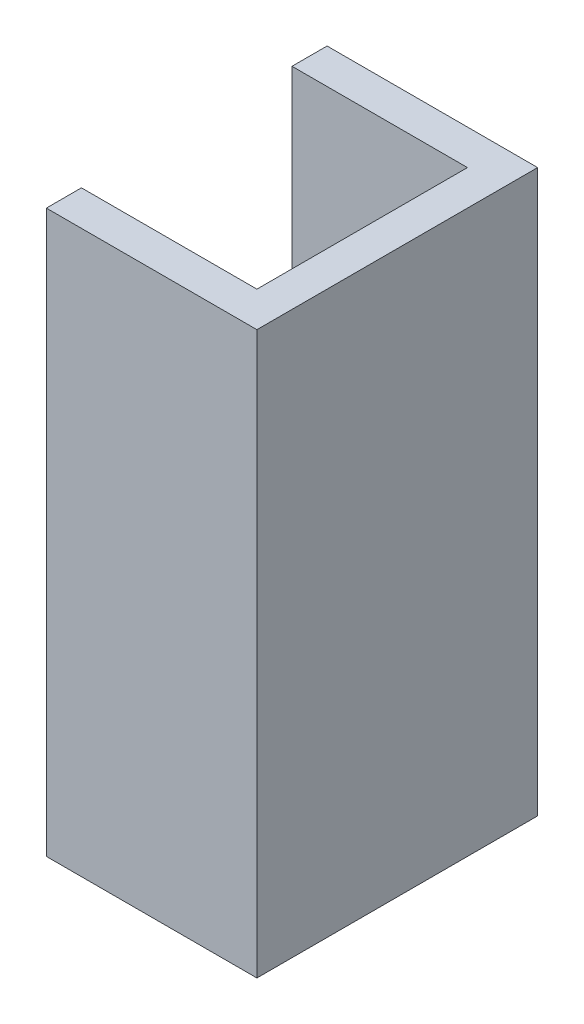
ISO-10303-21;
HEADER;
FILE_DESCRIPTION(('STEP AP214'),'2;1');
FILE_NAME('part.step','',(''),(''),'','','');
FILE_SCHEMA(('AUTOMOTIVE_DESIGN { 1 0 10303 214 1 1 1 1 }'));
ENDSEC;
DATA;
#1=APPLICATION_CONTEXT('core data for automotive mechanical design processes');
#2=APPLICATION_PROTOCOL_DEFINITION('international standard','automotive_design',2000,#1);
#3=PRODUCT_CONTEXT('',#1,'mechanical');
#4=PRODUCT('Part','Part','',(#3));
#5=PRODUCT_RELATED_PRODUCT_CATEGORY('part','',(#4));
#6=PRODUCT_DEFINITION_FORMATION('','',#4);
#7=PRODUCT_DEFINITION_CONTEXT('part definition',#1,'design');
#8=PRODUCT_DEFINITION('design','',#6,#7);
#9=PRODUCT_DEFINITION_SHAPE('','',#8);
#10=(LENGTH_UNIT() NAMED_UNIT(*) SI_UNIT(.MILLI.,.METRE.));
#11=(NAMED_UNIT(*) PLANE_ANGLE_UNIT() SI_UNIT($,.RADIAN.));
#12=(NAMED_UNIT(*) SI_UNIT($,.STERADIAN.) SOLID_ANGLE_UNIT());
#13=UNCERTAINTY_MEASURE_WITH_UNIT(LENGTH_MEASURE(1.E-05),#10,'distance_accuracy_value','');
#14=(GEOMETRIC_REPRESENTATION_CONTEXT(3) GLOBAL_UNCERTAINTY_ASSIGNED_CONTEXT((#13)) GLOBAL_UNIT_ASSIGNED_CONTEXT((#10,
#11,#12)) REPRESENTATION_CONTEXT('',''));
#15=CARTESIAN_POINT('',(0.,0.,0.));
#16=DIRECTION('',(0.,0.,1.));
#17=DIRECTION('',(1.,0.,0.));
#18=AXIS2_PLACEMENT_3D('',#15,#16,#17);
#19=CARTESIAN_POINT('',(-2.,9.7,0.42));
#20=DIRECTION('',(0.,0.,-1.));
#21=DIRECTION('',(1.,0.,0.));
#22=AXIS2_PLACEMENT_3D('',#19,#20,#21);
#23=PLANE('',#22);
#24=DIRECTION('',(0.,-1.,0.));
#25=VECTOR('',#24,1.);
#26=CARTESIAN_POINT('',(-1.7,9.7,0.42));
#27=LINE('',#26,#25);
#28=CARTESIAN_POINT('',(-1.7,10.1,0.42));
#29=VERTEX_POINT('',#28);
#30=CARTESIAN_POINT('',(-1.7,9.3,0.42));
#31=VERTEX_POINT('',#30);
#32=EDGE_CURVE('E11',#29,#31,#27,.T.);
#33=ORIENTED_EDGE('',*,*,#32,.F.);
#34=DIRECTION('',(1.,0.,0.));
#35=VECTOR('',#34,1.);
#36=CARTESIAN_POINT('',(-1.85,10.1,0.42));
#37=LINE('',#36,#35);
#38=CARTESIAN_POINT('',(-2.,10.1,0.42));
#39=VERTEX_POINT('',#38);
#40=EDGE_CURVE('E25',#39,#29,#37,.T.);
#41=ORIENTED_EDGE('',*,*,#40,.F.);
#42=DIRECTION('',(0.,-1.,0.));
#43=VECTOR('',#42,1.);
#44=CARTESIAN_POINT('',(-2.,9.7,0.42));
#45=LINE('',#44,#43);
#46=CARTESIAN_POINT('',(-2.,9.3,0.42));
#47=VERTEX_POINT('',#46);
#48=EDGE_CURVE('E100',#39,#47,#45,.T.);
#49=ORIENTED_EDGE('',*,*,#48,.T.);
#50=DIRECTION('',(1.,0.,0.));
#51=VECTOR('',#50,1.);
#52=CARTESIAN_POINT('',(-1.85,9.3,0.42));
#53=LINE('',#52,#51);
#54=EDGE_CURVE('E162',#47,#31,#53,.T.);
#55=ORIENTED_EDGE('',*,*,#54,.T.);
#56=EDGE_LOOP('',(#33,#41,#49,#55));
#57=FACE_BOUND('',#56,.T.);
#58=ADVANCED_FACE('F17',(#57),#23,.F.);
#59=CARTESIAN_POINT('',(-2.5,9.3,0.02));
#60=DIRECTION('',(0.,-1.,0.));
#61=DIRECTION('',(1.,0.,0.));
#62=AXIS2_PLACEMENT_3D('',#59,#60,#61);
#63=PLANE('',#62);
#64=ORIENTED_EDGE('',*,*,#54,.F.);
#65=DIRECTION('',(0.,0.,-1.));
#66=VECTOR('',#65,1.);
#67=CARTESIAN_POINT('',(-2.,9.3,0.395));
#68=LINE('',#67,#66);
#69=CARTESIAN_POINT('',(-2.,9.3,0.37));
#70=VERTEX_POINT('',#69);
#71=EDGE_CURVE('E158',#47,#70,#68,.T.);
#72=ORIENTED_EDGE('',*,*,#71,.T.);
#73=DIRECTION('',(1.,0.,0.));
#74=VECTOR('',#73,1.);
#75=CARTESIAN_POINT('',(-1.875,9.3,0.37));
#76=LINE('',#75,#74);
#77=CARTESIAN_POINT('',(-1.75,9.3,0.37));
#78=VERTEX_POINT('',#77);
#79=EDGE_CURVE('E94',#70,#78,#76,.T.);
#80=ORIENTED_EDGE('',*,*,#79,.T.);
#81=DIRECTION('',(0.,0.,-1.));
#82=VECTOR('',#81,1.);
#83=CARTESIAN_POINT('',(-1.75,9.3,0.22));
#84=LINE('',#83,#82);
#85=CARTESIAN_POINT('',(-1.75,9.3,0.07));
#86=VERTEX_POINT('',#85);
#87=EDGE_CURVE('E151',#78,#86,#84,.T.);
#88=ORIENTED_EDGE('',*,*,#87,.T.);
#89=DIRECTION('',(-1.,0.,0.));
#90=VECTOR('',#89,1.);
#91=CARTESIAN_POINT('',(-1.875,9.3,0.07));
#92=LINE('',#91,#90);
#93=CARTESIAN_POINT('',(-2.,9.3,0.07));
#94=VERTEX_POINT('',#93);
#95=EDGE_CURVE('E147',#86,#94,#92,.T.);
#96=ORIENTED_EDGE('',*,*,#95,.T.);
#97=DIRECTION('',(0.,0.,-1.));
#98=VECTOR('',#97,1.);
#99=CARTESIAN_POINT('',(-2.,9.3,0.045));
#100=LINE('',#99,#98);
#101=CARTESIAN_POINT('',(-2.,9.3,0.02));
#102=VERTEX_POINT('',#101);
#103=EDGE_CURVE('E143',#94,#102,#100,.T.);
#104=ORIENTED_EDGE('',*,*,#103,.T.);
#105=DIRECTION('',(-1.,0.,0.));
#106=VECTOR('',#105,1.);
#107=CARTESIAN_POINT('',(-1.85,9.3,0.02));
#108=LINE('',#107,#106);
#109=CARTESIAN_POINT('',(-1.7,9.3,0.02));
#110=VERTEX_POINT('',#109);
#111=EDGE_CURVE('E138',#110,#102,#108,.T.);
#112=ORIENTED_EDGE('',*,*,#111,.F.);
#113=DIRECTION('',(0.,0.,-1.));
#114=VECTOR('',#113,1.);
#115=CARTESIAN_POINT('',(-1.7,9.3,0.22));
#116=LINE('',#115,#114);
#117=EDGE_CURVE('E133',#31,#110,#116,.T.);
#118=ORIENTED_EDGE('',*,*,#117,.F.);
#119=EDGE_LOOP('',(#64,#72,#80,#88,#96,#104,#112,#118));
#120=FACE_BOUND('',#119,.T.);
#121=ADVANCED_FACE('F211',(#120),#63,.T.);
#122=CARTESIAN_POINT('',(-1.7,9.7,0.42));
#123=DIRECTION('',(-1.,0.,0.));
#124=DIRECTION('',(0.,0.,-1.));
#125=AXIS2_PLACEMENT_3D('',#122,#123,#124);
#126=PLANE('',#125);
#127=DIRECTION('',(0.,-1.,0.));
#128=VECTOR('',#127,1.);
#129=CARTESIAN_POINT('',(-1.7,9.7,0.02));
#130=LINE('',#129,#128);
#131=CARTESIAN_POINT('',(-1.7,10.1,0.02));
#132=VERTEX_POINT('',#131);
#133=EDGE_CURVE('E128',#132,#110,#130,.T.);
#134=ORIENTED_EDGE('',*,*,#133,.F.);
#135=DIRECTION('',(0.,0.,-1.));
#136=VECTOR('',#135,1.);
#137=CARTESIAN_POINT('',(-1.7,10.1,0.22));
#138=LINE('',#137,#136);
#139=EDGE_CURVE('E124',#29,#132,#138,.T.);
#140=ORIENTED_EDGE('',*,*,#139,.F.);
#141=ORIENTED_EDGE('',*,*,#32,.T.);
#142=ORIENTED_EDGE('',*,*,#117,.T.);
#143=EDGE_LOOP('',(#134,#140,#141,#142));
#144=FACE_BOUND('',#143,.T.);
#145=ADVANCED_FACE('F176',(#144),#126,.F.);
#146=CARTESIAN_POINT('',(-2.5,10.1,0.02));
#147=DIRECTION('',(0.,-1.,0.));
#148=DIRECTION('',(1.,0.,0.));
#149=AXIS2_PLACEMENT_3D('',#146,#147,#148);
#150=PLANE('',#149);
#151=ORIENTED_EDGE('',*,*,#139,.T.);
#152=DIRECTION('',(-1.,0.,0.));
#153=VECTOR('',#152,1.);
#154=CARTESIAN_POINT('',(-1.85,10.1,0.02));
#155=LINE('',#154,#153);
#156=CARTESIAN_POINT('',(-2.,10.1,0.02));
#157=VERTEX_POINT('',#156);
#158=EDGE_CURVE('E120',#132,#157,#155,.T.);
#159=ORIENTED_EDGE('',*,*,#158,.T.);
#160=DIRECTION('',(0.,0.,-1.));
#161=VECTOR('',#160,1.);
#162=CARTESIAN_POINT('',(-2.,10.1,0.045));
#163=LINE('',#162,#161);
#164=CARTESIAN_POINT('',(-2.,10.1,0.07));
#165=VERTEX_POINT('',#164);
#166=EDGE_CURVE('E115',#165,#157,#163,.T.);
#167=ORIENTED_EDGE('',*,*,#166,.F.);
#168=DIRECTION('',(-1.,0.,0.));
#169=VECTOR('',#168,1.);
#170=CARTESIAN_POINT('',(-1.875,10.1,0.07));
#171=LINE('',#170,#169);
#172=CARTESIAN_POINT('',(-1.75,10.1,0.07));
#173=VERTEX_POINT('',#172);
#174=EDGE_CURVE('E110',#173,#165,#171,.T.);
#175=ORIENTED_EDGE('',*,*,#174,.F.);
#176=DIRECTION('',(0.,0.,-1.));
#177=VECTOR('',#176,1.);
#178=CARTESIAN_POINT('',(-1.75,10.1,0.22));
#179=LINE('',#178,#177);
#180=CARTESIAN_POINT('',(-1.75,10.1,0.37));
#181=VERTEX_POINT('',#180);
#182=EDGE_CURVE('E85',#181,#173,#179,.T.);
#183=ORIENTED_EDGE('',*,*,#182,.F.);
#184=DIRECTION('',(1.,0.,0.));
#185=VECTOR('',#184,1.);
#186=CARTESIAN_POINT('',(-1.875,10.1,0.37));
#187=LINE('',#186,#185);
#188=CARTESIAN_POINT('',(-2.,10.1,0.37));
#189=VERTEX_POINT('',#188);
#190=EDGE_CURVE('E77',#189,#181,#187,.T.);
#191=ORIENTED_EDGE('',*,*,#190,.F.);
#192=DIRECTION('',(0.,0.,-1.));
#193=VECTOR('',#192,1.);
#194=CARTESIAN_POINT('',(-2.,10.1,0.395));
#195=LINE('',#194,#193);
#196=EDGE_CURVE('E82',#39,#189,#195,.T.);
#197=ORIENTED_EDGE('',*,*,#196,.F.);
#198=ORIENTED_EDGE('',*,*,#40,.T.);
#199=EDGE_LOOP('',(#151,#159,#167,#175,#183,#191,#197,#198));
#200=FACE_BOUND('',#199,.T.);
#201=ADVANCED_FACE('F80',(#200),#150,.F.);
#202=CARTESIAN_POINT('',(-2.,9.7,0.42));
#203=DIRECTION('',(-1.,0.,0.));
#204=DIRECTION('',(0.,0.,-1.));
#205=AXIS2_PLACEMENT_3D('',#202,#203,#204);
#206=PLANE('',#205);
#207=ORIENTED_EDGE('',*,*,#48,.F.);
#208=ORIENTED_EDGE('',*,*,#196,.T.);
#209=DIRECTION('',(0.,-1.,0.));
#210=VECTOR('',#209,1.);
#211=CARTESIAN_POINT('',(-2.,9.7,0.37));
#212=LINE('',#211,#210);
#213=EDGE_CURVE('E92',#189,#70,#212,.T.);
#214=ORIENTED_EDGE('',*,*,#213,.T.);
#215=ORIENTED_EDGE('',*,*,#71,.F.);
#216=EDGE_LOOP('',(#207,#208,#214,#215));
#217=FACE_BOUND('',#216,.T.);
#218=ADVANCED_FACE('F99',(#217),#206,.T.);
#219=CARTESIAN_POINT('',(-2.,9.7,0.37));
#220=DIRECTION('',(0.,0.,-1.));
#221=DIRECTION('',(1.,0.,0.));
#222=AXIS2_PLACEMENT_3D('',#219,#220,#221);
#223=PLANE('',#222);
#224=ORIENTED_EDGE('',*,*,#213,.F.);
#225=ORIENTED_EDGE('',*,*,#190,.T.);
#226=DIRECTION('',(0.,-1.,0.));
#227=VECTOR('',#226,1.);
#228=CARTESIAN_POINT('',(-1.75,9.7,0.37));
#229=LINE('',#228,#227);
#230=EDGE_CURVE('E97',#181,#78,#229,.T.);
#231=ORIENTED_EDGE('',*,*,#230,.T.);
#232=ORIENTED_EDGE('',*,*,#79,.F.);
#233=EDGE_LOOP('',(#224,#225,#231,#232));
#234=FACE_BOUND('',#233,.T.);
#235=ADVANCED_FACE('F93',(#234),#223,.T.);
#236=CARTESIAN_POINT('',(-1.75,9.7,0.37));
#237=DIRECTION('',(-1.,0.,0.));
#238=DIRECTION('',(0.,0.,-1.));
#239=AXIS2_PLACEMENT_3D('',#236,#237,#238);
#240=PLANE('',#239);
#241=ORIENTED_EDGE('',*,*,#230,.F.);
#242=ORIENTED_EDGE('',*,*,#182,.T.);
#243=DIRECTION('',(0.,-1.,0.));
#244=VECTOR('',#243,1.);
#245=CARTESIAN_POINT('',(-1.75,9.7,0.07));
#246=LINE('',#245,#244);
#247=EDGE_CURVE('E195',#173,#86,#246,.T.);
#248=ORIENTED_EDGE('',*,*,#247,.T.);
#249=ORIENTED_EDGE('',*,*,#87,.F.);
#250=EDGE_LOOP('',(#241,#242,#248,#249));
#251=FACE_BOUND('',#250,.T.);
#252=ADVANCED_FACE('F193',(#251),#240,.T.);
#253=CARTESIAN_POINT('',(-1.75,9.7,0.07));
#254=DIRECTION('',(0.,0.,1.));
#255=DIRECTION('',(-1.,0.,0.));
#256=AXIS2_PLACEMENT_3D('',#253,#254,#255);
#257=PLANE('',#256);
#258=ORIENTED_EDGE('',*,*,#247,.F.);
#259=ORIENTED_EDGE('',*,*,#174,.T.);
#260=DIRECTION('',(0.,-1.,0.));
#261=VECTOR('',#260,1.);
#262=CARTESIAN_POINT('',(-2.,9.7,0.07));
#263=LINE('',#262,#261);
#264=EDGE_CURVE('E184',#165,#94,#263,.T.);
#265=ORIENTED_EDGE('',*,*,#264,.T.);
#266=ORIENTED_EDGE('',*,*,#95,.F.);
#267=EDGE_LOOP('',(#258,#259,#265,#266));
#268=FACE_BOUND('',#267,.T.);
#269=ADVANCED_FACE('F197',(#268),#257,.T.);
#270=CARTESIAN_POINT('',(-2.,9.7,0.42));
#271=DIRECTION('',(-1.,0.,0.));
#272=DIRECTION('',(0.,0.,-1.));
#273=AXIS2_PLACEMENT_3D('',#270,#271,#272);
#274=PLANE('',#273);
#275=ORIENTED_EDGE('',*,*,#264,.F.);
#276=ORIENTED_EDGE('',*,*,#166,.T.);
#277=DIRECTION('',(0.,-1.,0.));
#278=VECTOR('',#277,1.);
#279=CARTESIAN_POINT('',(-2.,9.7,0.02));
#280=LINE('',#279,#278);
#281=EDGE_CURVE('E181',#157,#102,#280,.T.);
#282=ORIENTED_EDGE('',*,*,#281,.T.);
#283=ORIENTED_EDGE('',*,*,#103,.F.);
#284=EDGE_LOOP('',(#275,#276,#282,#283));
#285=FACE_BOUND('',#284,.T.);
#286=ADVANCED_FACE('F187',(#285),#274,.T.);
#287=CARTESIAN_POINT('',(-1.7,9.7,0.02));
#288=DIRECTION('',(0.,0.,1.));
#289=DIRECTION('',(-1.,0.,0.));
#290=AXIS2_PLACEMENT_3D('',#287,#288,#289);
#291=PLANE('',#290);
#292=ORIENTED_EDGE('',*,*,#281,.F.);
#293=ORIENTED_EDGE('',*,*,#158,.F.);
#294=ORIENTED_EDGE('',*,*,#133,.T.);
#295=ORIENTED_EDGE('',*,*,#111,.T.);
#296=EDGE_LOOP('',(#292,#293,#294,#295));
#297=FACE_BOUND('',#296,.T.);
#298=ADVANCED_FACE('F179',(#297),#291,.F.);
#299=CLOSED_SHELL('',(#58,#121,#145,#201,#218,#235,#252,#269,#286,#298));
#300=MANIFOLD_SOLID_BREP('B1',#299);
#301=ADVANCED_BREP_SHAPE_REPRESENTATION('',(#18,#300),#14);
#302=SHAPE_DEFINITION_REPRESENTATION(#9,#301);
ENDSEC;
END-ISO-10303-21;
